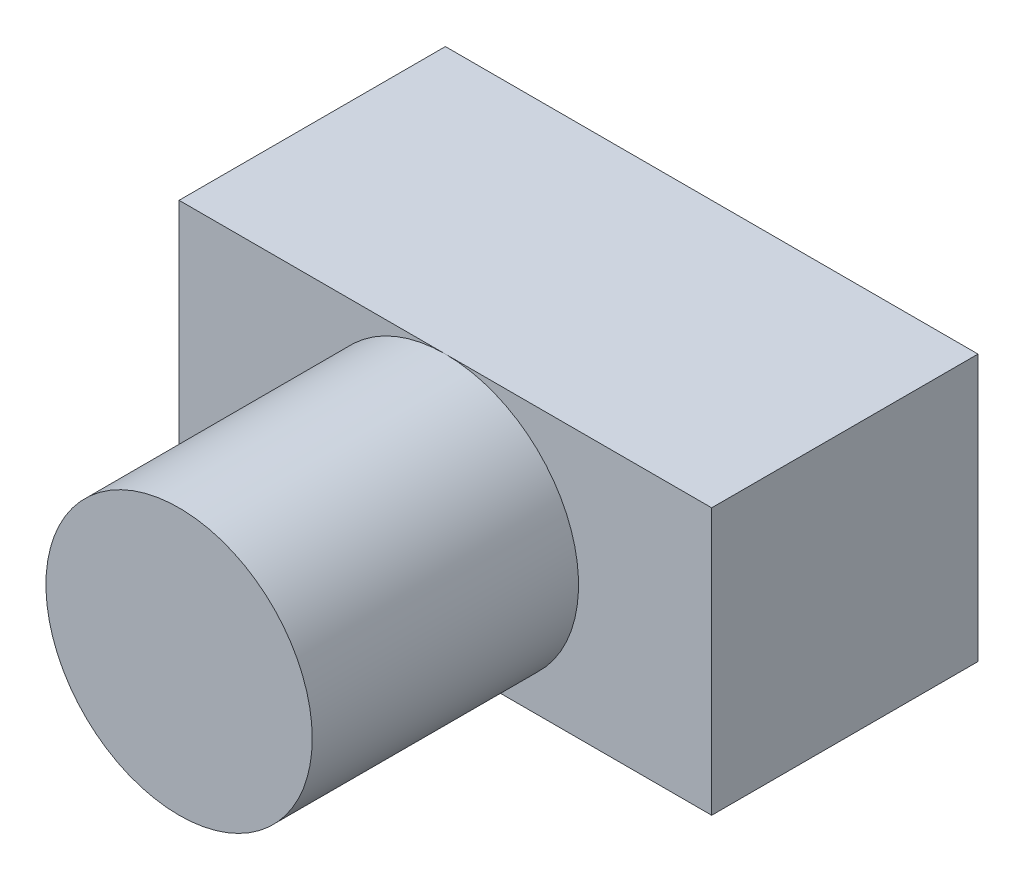
ISO-10303-21;
HEADER;
FILE_DESCRIPTION(('STEP AP214'),'2;1');
FILE_NAME('part.step','',(''),(''),'','','');
FILE_SCHEMA(('AUTOMOTIVE_DESIGN { 1 0 10303 214 1 1 1 1 }'));
ENDSEC;
DATA;
#1=APPLICATION_CONTEXT('core data for automotive mechanical design processes');
#2=APPLICATION_PROTOCOL_DEFINITION('international standard','automotive_design',2000,#1);
#3=PRODUCT_CONTEXT('',#1,'mechanical');
#4=PRODUCT('Part','Part','',(#3));
#5=PRODUCT_RELATED_PRODUCT_CATEGORY('part','',(#4));
#6=PRODUCT_DEFINITION_FORMATION('','',#4);
#7=PRODUCT_DEFINITION_CONTEXT('part definition',#1,'design');
#8=PRODUCT_DEFINITION('design','',#6,#7);
#9=PRODUCT_DEFINITION_SHAPE('','',#8);
#10=(LENGTH_UNIT() NAMED_UNIT(*) SI_UNIT(.MILLI.,.METRE.));
#11=(NAMED_UNIT(*) PLANE_ANGLE_UNIT() SI_UNIT($,.RADIAN.));
#12=(NAMED_UNIT(*) SI_UNIT($,.STERADIAN.) SOLID_ANGLE_UNIT());
#13=UNCERTAINTY_MEASURE_WITH_UNIT(LENGTH_MEASURE(1.E-05),#10,'distance_accuracy_value','');
#14=(GEOMETRIC_REPRESENTATION_CONTEXT(3) GLOBAL_UNCERTAINTY_ASSIGNED_CONTEXT((#13)) GLOBAL_UNIT_ASSIGNED_CONTEXT((#10,
#11,#12)) REPRESENTATION_CONTEXT('',''));
#15=CARTESIAN_POINT('',(0.,0.,0.));
#16=DIRECTION('',(0.,0.,1.));
#17=DIRECTION('',(1.,0.,0.));
#18=AXIS2_PLACEMENT_3D('',#15,#16,#17);
#19=CARTESIAN_POINT('',(0.,0.,5.));
#20=DIRECTION('',(0.,0.,1.));
#21=DIRECTION('',(1.,0.,0.));
#22=AXIS2_PLACEMENT_3D('',#19,#20,#21);
#23=PLANE('',#22);
#24=CARTESIAN_POINT('',(-5.,2.5,5.));
#25=DIRECTION('',(0.,0.,1.));
#26=DIRECTION('',(1.,0.,0.));
#27=AXIS2_PLACEMENT_3D('',#24,#25,#26);
#28=CIRCLE('',#27,2.5);
#29=CARTESIAN_POINT('',(-5.,5.,5.));
#30=VERTEX_POINT('',#29);
#31=CARTESIAN_POINT('',(-5.,0.,5.));
#32=VERTEX_POINT('',#31);
#33=EDGE_CURVE('E45',#30,#32,#28,.T.);
#34=ORIENTED_EDGE('',*,*,#33,.F.);
#35=DIRECTION('',(-1.,0.,0.));
#36=VECTOR('',#35,1.);
#37=CARTESIAN_POINT('',(-10.,5.,5.));
#38=LINE('',#37,#36);
#39=CARTESIAN_POINT('',(-10.,5.,5.));
#40=VERTEX_POINT('',#39);
#41=EDGE_CURVE('E59',#30,#40,#38,.T.);
#42=ORIENTED_EDGE('',*,*,#41,.T.);
#43=DIRECTION('',(0.,-1.,0.));
#44=VECTOR('',#43,1.);
#45=CARTESIAN_POINT('',(-10.,5.,5.));
#46=LINE('',#45,#44);
#47=CARTESIAN_POINT('',(-10.,0.,5.));
#48=VERTEX_POINT('',#47);
#49=EDGE_CURVE('E152',#40,#48,#46,.T.);
#50=ORIENTED_EDGE('',*,*,#49,.T.);
#51=DIRECTION('',(1.,0.,0.));
#52=VECTOR('',#51,1.);
#53=CARTESIAN_POINT('',(-10.,0.,5.));
#54=LINE('',#53,#52);
#55=EDGE_CURVE('E88',#48,#32,#54,.T.);
#56=ORIENTED_EDGE('',*,*,#55,.T.);
#57=EDGE_LOOP('',(#34,#42,#50,#56));
#58=FACE_BOUND('',#57,.T.);
#59=ADVANCED_FACE('F35',(#58),#23,.T.);
#60=CARTESIAN_POINT('',(-10.,5.,5.));
#61=DIRECTION('',(1.,0.,0.));
#62=DIRECTION('',(0.,1.,0.));
#63=AXIS2_PLACEMENT_3D('',#60,#61,#62);
#64=PLANE('',#63);
#65=DIRECTION('',(0.,-1.,0.));
#66=VECTOR('',#65,1.);
#67=CARTESIAN_POINT('',(-10.,5.,0.));
#68=LINE('',#67,#66);
#69=CARTESIAN_POINT('',(-10.,5.,0.));
#70=VERTEX_POINT('',#69);
#71=CARTESIAN_POINT('',(-10.,0.,0.));
#72=VERTEX_POINT('',#71);
#73=EDGE_CURVE('E148',#70,#72,#68,.T.);
#74=ORIENTED_EDGE('',*,*,#73,.T.);
#75=DIRECTION('',(0.,0.,-1.));
#76=VECTOR('',#75,1.);
#77=CARTESIAN_POINT('',(-10.,0.,5.));
#78=LINE('',#77,#76);
#79=EDGE_CURVE('E39',#48,#72,#78,.T.);
#80=ORIENTED_EDGE('',*,*,#79,.F.);
#81=ORIENTED_EDGE('',*,*,#49,.F.);
#82=DIRECTION('',(0.,0.,-1.));
#83=VECTOR('',#82,1.);
#84=CARTESIAN_POINT('',(-10.,5.,5.));
#85=LINE('',#84,#83);
#86=EDGE_CURVE('E96',#40,#70,#85,.T.);
#87=ORIENTED_EDGE('',*,*,#86,.T.);
#88=EDGE_LOOP('',(#74,#80,#81,#87));
#89=FACE_BOUND('',#88,.T.);
#90=ADVANCED_FACE('F37',(#89),#64,.F.);
#91=CARTESIAN_POINT('',(-10.,0.,5.));
#92=DIRECTION('',(0.,1.,0.));
#93=DIRECTION('',(0.,0.,1.));
#94=AXIS2_PLACEMENT_3D('',#91,#92,#93);
#95=PLANE('',#94);
#96=DIRECTION('',(1.,0.,0.));
#97=VECTOR('',#96,1.);
#98=CARTESIAN_POINT('',(-10.,0.,0.));
#99=LINE('',#98,#97);
#100=CARTESIAN_POINT('',(0.,0.,0.));
#101=VERTEX_POINT('',#100);
#102=EDGE_CURVE('E140',#72,#101,#99,.T.);
#103=ORIENTED_EDGE('',*,*,#102,.T.);
#104=DIRECTION('',(0.,0.,-1.));
#105=VECTOR('',#104,1.);
#106=CARTESIAN_POINT('',(0.,0.,5.));
#107=LINE('',#106,#105);
#108=CARTESIAN_POINT('',(0.,0.,5.));
#109=VERTEX_POINT('',#108);
#110=EDGE_CURVE('E142',#109,#101,#107,.T.);
#111=ORIENTED_EDGE('',*,*,#110,.F.);
#112=EDGE_CURVE('E162',#32,#109,#54,.T.);
#113=ORIENTED_EDGE('',*,*,#112,.F.);
#114=ORIENTED_EDGE('',*,*,#55,.F.);
#115=ORIENTED_EDGE('',*,*,#79,.T.);
#116=EDGE_LOOP('',(#103,#111,#113,#114,#115));
#117=FACE_BOUND('',#116,.T.);
#118=ADVANCED_FACE('F123',(#117),#95,.F.);
#119=CARTESIAN_POINT('',(0.,5.,5.));
#120=DIRECTION('',(-1.,0.,0.));
#121=DIRECTION('',(0.,0.,1.));
#122=AXIS2_PLACEMENT_3D('',#119,#120,#121);
#123=PLANE('',#122);
#124=DIRECTION('',(0.,1.,0.));
#125=VECTOR('',#124,1.);
#126=CARTESIAN_POINT('',(0.,5.,0.));
#127=LINE('',#126,#125);
#128=CARTESIAN_POINT('',(0.,5.,0.));
#129=VERTEX_POINT('',#128);
#130=EDGE_CURVE('E147',#101,#129,#127,.T.);
#131=ORIENTED_EDGE('',*,*,#130,.T.);
#132=DIRECTION('',(0.,0.,-1.));
#133=VECTOR('',#132,1.);
#134=CARTESIAN_POINT('',(0.,5.,5.));
#135=LINE('',#134,#133);
#136=CARTESIAN_POINT('',(0.,5.,5.));
#137=VERTEX_POINT('',#136);
#138=EDGE_CURVE('E150',#137,#129,#135,.T.);
#139=ORIENTED_EDGE('',*,*,#138,.F.);
#140=DIRECTION('',(0.,1.,0.));
#141=VECTOR('',#140,1.);
#142=CARTESIAN_POINT('',(0.,5.,5.));
#143=LINE('',#142,#141);
#144=EDGE_CURVE('E94',#109,#137,#143,.T.);
#145=ORIENTED_EDGE('',*,*,#144,.F.);
#146=ORIENTED_EDGE('',*,*,#110,.T.);
#147=EDGE_LOOP('',(#131,#139,#145,#146));
#148=FACE_BOUND('',#147,.T.);
#149=ADVANCED_FACE('F129',(#148),#123,.F.);
#150=CARTESIAN_POINT('',(-10.,5.,5.));
#151=DIRECTION('',(0.,-1.,0.));
#152=DIRECTION('',(0.,0.,-1.));
#153=AXIS2_PLACEMENT_3D('',#150,#151,#152);
#154=PLANE('',#153);
#155=DIRECTION('',(-1.,0.,0.));
#156=VECTOR('',#155,1.);
#157=CARTESIAN_POINT('',(-10.,5.,0.));
#158=LINE('',#157,#156);
#159=EDGE_CURVE('E81',#129,#70,#158,.T.);
#160=ORIENTED_EDGE('',*,*,#159,.T.);
#161=ORIENTED_EDGE('',*,*,#86,.F.);
#162=ORIENTED_EDGE('',*,*,#41,.F.);
#163=EDGE_CURVE('E91',#137,#30,#38,.T.);
#164=ORIENTED_EDGE('',*,*,#163,.F.);
#165=ORIENTED_EDGE('',*,*,#138,.T.);
#166=EDGE_LOOP('',(#160,#161,#162,#164,#165));
#167=FACE_BOUND('',#166,.T.);
#168=ADVANCED_FACE('F98',(#167),#154,.F.);
#169=EDGE_CURVE('E11',#32,#30,#28,.T.);
#170=ORIENTED_EDGE('',*,*,#169,.F.);
#171=ORIENTED_EDGE('',*,*,#112,.T.);
#172=ORIENTED_EDGE('',*,*,#144,.T.);
#173=ORIENTED_EDGE('',*,*,#163,.T.);
#174=EDGE_LOOP('',(#170,#171,#172,#173));
#175=FACE_BOUND('',#174,.T.);
#176=ADVANCED_FACE('F92',(#175),#23,.T.);
#177=CARTESIAN_POINT('',(0.,0.,0.));
#178=DIRECTION('',(0.,0.,1.));
#179=DIRECTION('',(1.,0.,0.));
#180=AXIS2_PLACEMENT_3D('',#177,#178,#179);
#181=PLANE('',#180);
#182=ORIENTED_EDGE('',*,*,#73,.F.);
#183=ORIENTED_EDGE('',*,*,#159,.F.);
#184=ORIENTED_EDGE('',*,*,#130,.F.);
#185=ORIENTED_EDGE('',*,*,#102,.F.);
#186=EDGE_LOOP('',(#182,#183,#184,#185));
#187=FACE_BOUND('',#186,.T.);
#188=ADVANCED_FACE('F106',(#187),#181,.F.);
#189=CARTESIAN_POINT('',(-5.,2.5,10.));
#190=DIRECTION('',(0.,0.,-1.));
#191=DIRECTION('',(-1.,0.,0.));
#192=AXIS2_PLACEMENT_3D('',#189,#190,#191);
#193=CYLINDRICAL_SURFACE('',#192,2.5);
#194=CARTESIAN_POINT('',(-5.,2.5,10.));
#195=DIRECTION('',(0.,0.,1.));
#196=DIRECTION('',(1.,0.,0.));
#197=AXIS2_PLACEMENT_3D('',#194,#195,#196);
#198=CIRCLE('',#197,2.5);
#199=CARTESIAN_POINT('',(-2.5,2.5,10.));
#200=VERTEX_POINT('',#199);
#201=EDGE_CURVE('E102',#200,#200,#198,.T.);
#202=ORIENTED_EDGE('',*,*,#201,.F.);
#203=EDGE_LOOP('',(#202));
#204=FACE_BOUND('',#203,.T.);
#205=ORIENTED_EDGE('',*,*,#33,.T.);
#206=ORIENTED_EDGE('',*,*,#169,.T.);
#207=EDGE_LOOP('',(#205,#206));
#208=FACE_BOUND('',#207,.T.);
#209=ADVANCED_FACE('F103',(#204,#208),#193,.T.);
#210=CARTESIAN_POINT('',(-5.,2.5,10.));
#211=DIRECTION('',(0.,0.,1.));
#212=DIRECTION('',(1.,0.,0.));
#213=AXIS2_PLACEMENT_3D('',#210,#211,#212);
#214=PLANE('',#213);
#215=ORIENTED_EDGE('',*,*,#201,.T.);
#216=EDGE_LOOP('',(#215));
#217=FACE_BOUND('',#216,.T.);
#218=ADVANCED_FACE('F105',(#217),#214,.T.);
#219=CLOSED_SHELL('',(#59,#90,#118,#149,#168,#176,#188,#209,#218));
#220=MANIFOLD_SOLID_BREP('B2',#219);
#221=ADVANCED_BREP_SHAPE_REPRESENTATION('',(#18,#220),#14);
#222=SHAPE_DEFINITION_REPRESENTATION(#9,#221);
ENDSEC;
END-ISO-10303-21;
